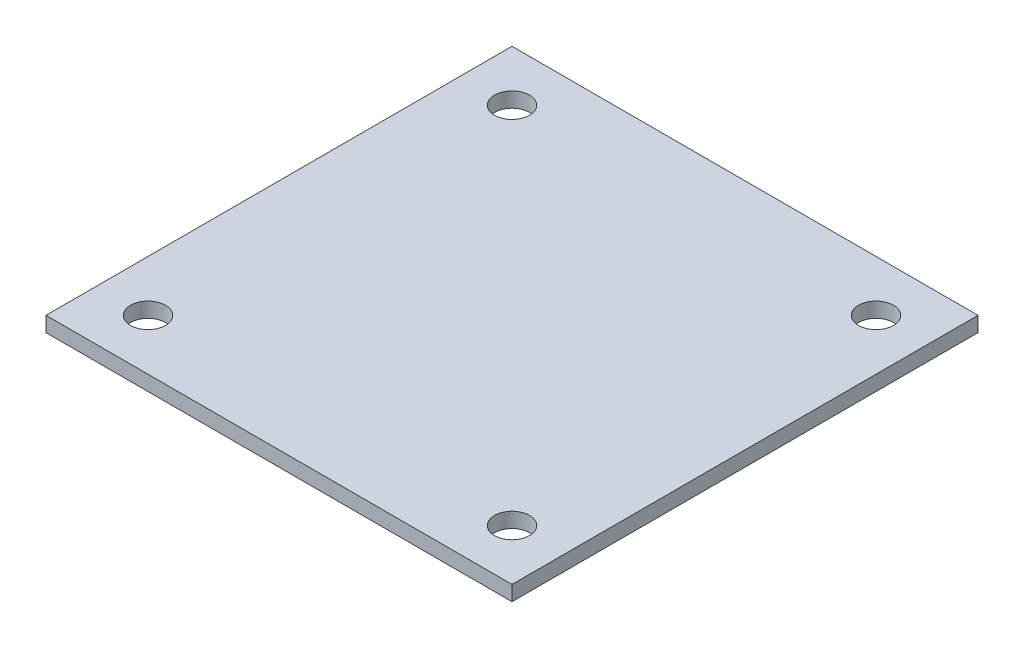
ISO-10303-21;
HEADER;
FILE_DESCRIPTION(('STEP AP214'),'2;1');
FILE_NAME('part.step','',(''),(''),'','','');
FILE_SCHEMA(('AUTOMOTIVE_DESIGN { 1 0 10303 214 1 1 1 1 }'));
ENDSEC;
DATA;
#1=APPLICATION_CONTEXT('core data for automotive mechanical design processes');
#2=APPLICATION_PROTOCOL_DEFINITION('international standard','automotive_design',2000,#1);
#3=PRODUCT_CONTEXT('',#1,'mechanical');
#4=PRODUCT('Part','Part','',(#3));
#5=PRODUCT_RELATED_PRODUCT_CATEGORY('part','',(#4));
#6=PRODUCT_DEFINITION_FORMATION('','',#4);
#7=PRODUCT_DEFINITION_CONTEXT('part definition',#1,'design');
#8=PRODUCT_DEFINITION('design','',#6,#7);
#9=PRODUCT_DEFINITION_SHAPE('','',#8);
#10=(LENGTH_UNIT() NAMED_UNIT(*) SI_UNIT(.MILLI.,.METRE.));
#11=(NAMED_UNIT(*) PLANE_ANGLE_UNIT() SI_UNIT($,.RADIAN.));
#12=(NAMED_UNIT(*) SI_UNIT($,.STERADIAN.) SOLID_ANGLE_UNIT());
#13=UNCERTAINTY_MEASURE_WITH_UNIT(LENGTH_MEASURE(1.E-05),#10,'distance_accuracy_value','');
#14=(GEOMETRIC_REPRESENTATION_CONTEXT(3) GLOBAL_UNCERTAINTY_ASSIGNED_CONTEXT((#13)) GLOBAL_UNIT_ASSIGNED_CONTEXT((#10,
#11,#12)) REPRESENTATION_CONTEXT('',''));
#15=CARTESIAN_POINT('',(0.,0.,0.));
#16=DIRECTION('',(0.,0.,1.));
#17=DIRECTION('',(1.,0.,0.));
#18=AXIS2_PLACEMENT_3D('',#15,#16,#17);
#19=CARTESIAN_POINT('',(0.,1.5,0.));
#20=DIRECTION('',(0.,1.,0.));
#21=DIRECTION('',(0.,0.,1.));
#22=AXIS2_PLACEMENT_3D('',#19,#20,#21);
#23=PLANE('',#22);
#24=CARTESIAN_POINT('',(18.2,1.5,18.2));
#25=DIRECTION('',(0.,1.,0.));
#26=DIRECTION('',(0.,0.,-1.));
#27=AXIS2_PLACEMENT_3D('',#24,#25,#26);
#28=CIRCLE('',#27,1.75);
#29=CARTESIAN_POINT('',(18.2,1.5,16.45));
#30=VERTEX_POINT('',#29);
#31=EDGE_CURVE('E125',#30,#30,#28,.T.);
#32=ORIENTED_EDGE('',*,*,#31,.F.);
#33=EDGE_LOOP('',(#32));
#34=FACE_BOUND('',#33,.T.);
#35=CARTESIAN_POINT('',(-18.2,1.5,-18.2));
#36=DIRECTION('',(0.,1.,0.));
#37=DIRECTION('',(0.,0.,1.));
#38=AXIS2_PLACEMENT_3D('',#35,#36,#37);
#39=CIRCLE('',#38,1.75);
#40=CARTESIAN_POINT('',(-18.2,1.5,-16.45));
#41=VERTEX_POINT('',#40);
#42=EDGE_CURVE('E104',#41,#41,#39,.T.);
#43=ORIENTED_EDGE('',*,*,#42,.F.);
#44=EDGE_LOOP('',(#43));
#45=FACE_BOUND('',#44,.T.);
#46=DIRECTION('',(0.,0.,-1.));
#47=VECTOR('',#46,1.);
#48=CARTESIAN_POINT('',(23.3,1.5,-23.3));
#49=LINE('',#48,#47);
#50=CARTESIAN_POINT('',(23.3,1.5,23.3));
#51=VERTEX_POINT('',#50);
#52=CARTESIAN_POINT('',(23.3,1.5,-23.3));
#53=VERTEX_POINT('',#52);
#54=EDGE_CURVE('E89',#51,#53,#49,.T.);
#55=ORIENTED_EDGE('',*,*,#54,.T.);
#56=DIRECTION('',(-1.,0.,0.));
#57=VECTOR('',#56,1.);
#58=CARTESIAN_POINT('',(-23.3,1.5,-23.3));
#59=LINE('',#58,#57);
#60=CARTESIAN_POINT('',(-23.3,1.5,-23.3));
#61=VERTEX_POINT('',#60);
#62=EDGE_CURVE('E84',#53,#61,#59,.T.);
#63=ORIENTED_EDGE('',*,*,#62,.T.);
#64=DIRECTION('',(0.,0.,1.));
#65=VECTOR('',#64,1.);
#66=CARTESIAN_POINT('',(-23.3,1.5,-23.3));
#67=LINE('',#66,#65);
#68=CARTESIAN_POINT('',(-23.3,1.5,23.3));
#69=VERTEX_POINT('',#68);
#70=EDGE_CURVE('E87',#61,#69,#67,.T.);
#71=ORIENTED_EDGE('',*,*,#70,.T.);
#72=DIRECTION('',(1.,0.,0.));
#73=VECTOR('',#72,1.);
#74=CARTESIAN_POINT('',(-23.3,1.5,23.3));
#75=LINE('',#74,#73);
#76=EDGE_CURVE('E54',#69,#51,#75,.T.);
#77=ORIENTED_EDGE('',*,*,#76,.T.);
#78=EDGE_LOOP('',(#55,#63,#71,#77));
#79=FACE_BOUND('',#78,.T.);
#80=CARTESIAN_POINT('',(-18.2,1.5,18.2));
#81=DIRECTION('',(0.,1.,0.));
#82=DIRECTION('',(0.,0.,1.));
#83=AXIS2_PLACEMENT_3D('',#80,#81,#82);
#84=CIRCLE('',#83,1.75);
#85=CARTESIAN_POINT('',(-18.2,1.5,19.95));
#86=VERTEX_POINT('',#85);
#87=EDGE_CURVE('E119',#86,#86,#84,.T.);
#88=ORIENTED_EDGE('',*,*,#87,.F.);
#89=EDGE_LOOP('',(#88));
#90=FACE_BOUND('',#89,.T.);
#91=CARTESIAN_POINT('',(18.2,1.5,-18.2));
#92=DIRECTION('',(0.,1.,0.));
#93=DIRECTION('',(0.,0.,-1.));
#94=AXIS2_PLACEMENT_3D('',#91,#92,#93);
#95=CIRCLE('',#94,1.75);
#96=CARTESIAN_POINT('',(18.2,1.5,-19.95));
#97=VERTEX_POINT('',#96);
#98=EDGE_CURVE('E131',#97,#97,#95,.T.);
#99=ORIENTED_EDGE('',*,*,#98,.F.);
#100=EDGE_LOOP('',(#99));
#101=FACE_BOUND('',#100,.T.);
#102=ADVANCED_FACE('F37',(#34,#45,#79,#90,#101),#23,.T.);
#103=CARTESIAN_POINT('',(0.,0.,0.));
#104=DIRECTION('',(0.,1.,0.));
#105=DIRECTION('',(0.,0.,1.));
#106=AXIS2_PLACEMENT_3D('',#103,#104,#105);
#107=PLANE('',#106);
#108=DIRECTION('',(0.,0.,-1.));
#109=VECTOR('',#108,1.);
#110=CARTESIAN_POINT('',(23.3,0.,-23.3));
#111=LINE('',#110,#109);
#112=CARTESIAN_POINT('',(23.3,0.,23.3));
#113=VERTEX_POINT('',#112);
#114=CARTESIAN_POINT('',(23.3,0.,-23.3));
#115=VERTEX_POINT('',#114);
#116=EDGE_CURVE('E101',#113,#115,#111,.T.);
#117=ORIENTED_EDGE('',*,*,#116,.F.);
#118=DIRECTION('',(1.,0.,0.));
#119=VECTOR('',#118,1.);
#120=CARTESIAN_POINT('',(-23.3,0.,23.3));
#121=LINE('',#120,#119);
#122=CARTESIAN_POINT('',(-23.3,0.,23.3));
#123=VERTEX_POINT('',#122);
#124=EDGE_CURVE('E77',#123,#113,#121,.T.);
#125=ORIENTED_EDGE('',*,*,#124,.F.);
#126=DIRECTION('',(0.,0.,1.));
#127=VECTOR('',#126,1.);
#128=CARTESIAN_POINT('',(-23.3,0.,-23.3));
#129=LINE('',#128,#127);
#130=CARTESIAN_POINT('',(-23.3,0.,-23.3));
#131=VERTEX_POINT('',#130);
#132=EDGE_CURVE('E71',#131,#123,#129,.T.);
#133=ORIENTED_EDGE('',*,*,#132,.F.);
#134=DIRECTION('',(-1.,0.,0.));
#135=VECTOR('',#134,1.);
#136=CARTESIAN_POINT('',(-23.3,0.,-23.3));
#137=LINE('',#136,#135);
#138=EDGE_CURVE('E93',#115,#131,#137,.T.);
#139=ORIENTED_EDGE('',*,*,#138,.F.);
#140=EDGE_LOOP('',(#117,#125,#133,#139));
#141=FACE_BOUND('',#140,.T.);
#142=CARTESIAN_POINT('',(-18.2,0.,-18.2));
#143=DIRECTION('',(0.,1.,0.));
#144=DIRECTION('',(0.,0.,1.));
#145=AXIS2_PLACEMENT_3D('',#142,#143,#144);
#146=CIRCLE('',#145,1.75);
#147=CARTESIAN_POINT('',(-18.2,0.,-16.45));
#148=VERTEX_POINT('',#147);
#149=EDGE_CURVE('E116',#148,#148,#146,.T.);
#150=ORIENTED_EDGE('',*,*,#149,.T.);
#151=EDGE_LOOP('',(#150));
#152=FACE_BOUND('',#151,.T.);
#153=CARTESIAN_POINT('',(-18.2,0.,18.2));
#154=DIRECTION('',(0.,1.,0.));
#155=DIRECTION('',(0.,0.,1.));
#156=AXIS2_PLACEMENT_3D('',#153,#154,#155);
#157=CIRCLE('',#156,1.75);
#158=CARTESIAN_POINT('',(-18.2,0.,19.95));
#159=VERTEX_POINT('',#158);
#160=EDGE_CURVE('E122',#159,#159,#157,.T.);
#161=ORIENTED_EDGE('',*,*,#160,.T.);
#162=EDGE_LOOP('',(#161));
#163=FACE_BOUND('',#162,.T.);
#164=CARTESIAN_POINT('',(18.2,0.,18.2));
#165=DIRECTION('',(0.,1.,0.));
#166=DIRECTION('',(0.,0.,-1.));
#167=AXIS2_PLACEMENT_3D('',#164,#165,#166);
#168=CIRCLE('',#167,1.75);
#169=CARTESIAN_POINT('',(18.2,0.,16.45));
#170=VERTEX_POINT('',#169);
#171=EDGE_CURVE('E128',#170,#170,#168,.T.);
#172=ORIENTED_EDGE('',*,*,#171,.T.);
#173=EDGE_LOOP('',(#172));
#174=FACE_BOUND('',#173,.T.);
#175=CARTESIAN_POINT('',(18.2,0.,-18.2));
#176=DIRECTION('',(0.,1.,0.));
#177=DIRECTION('',(0.,0.,-1.));
#178=AXIS2_PLACEMENT_3D('',#175,#176,#177);
#179=CIRCLE('',#178,1.75);
#180=CARTESIAN_POINT('',(18.2,0.,-19.95));
#181=VERTEX_POINT('',#180);
#182=EDGE_CURVE('E134',#181,#181,#179,.T.);
#183=ORIENTED_EDGE('',*,*,#182,.T.);
#184=EDGE_LOOP('',(#183));
#185=FACE_BOUND('',#184,.T.);
#186=ADVANCED_FACE('F112',(#141,#152,#163,#174,#185),#107,.F.);
#187=CARTESIAN_POINT('',(23.3,1.5,-23.3));
#188=DIRECTION('',(-1.,0.,0.));
#189=DIRECTION('',(0.,0.,1.));
#190=AXIS2_PLACEMENT_3D('',#187,#188,#189);
#191=PLANE('',#190);
#192=ORIENTED_EDGE('',*,*,#116,.T.);
#193=DIRECTION('',(0.,-1.,0.));
#194=VECTOR('',#193,1.);
#195=CARTESIAN_POINT('',(23.3,1.5,-23.3));
#196=LINE('',#195,#194);
#197=EDGE_CURVE('E11',#53,#115,#196,.T.);
#198=ORIENTED_EDGE('',*,*,#197,.F.);
#199=ORIENTED_EDGE('',*,*,#54,.F.);
#200=DIRECTION('',(0.,-1.,0.));
#201=VECTOR('',#200,1.);
#202=CARTESIAN_POINT('',(23.3,1.5,23.3));
#203=LINE('',#202,#201);
#204=EDGE_CURVE('E97',#51,#113,#203,.T.);
#205=ORIENTED_EDGE('',*,*,#204,.T.);
#206=EDGE_LOOP('',(#192,#198,#199,#205));
#207=FACE_BOUND('',#206,.T.);
#208=ADVANCED_FACE('F39',(#207),#191,.F.);
#209=CARTESIAN_POINT('',(-23.3,1.5,-23.3));
#210=DIRECTION('',(0.,0.,1.));
#211=DIRECTION('',(1.,0.,0.));
#212=AXIS2_PLACEMENT_3D('',#209,#210,#211);
#213=PLANE('',#212);
#214=ORIENTED_EDGE('',*,*,#138,.T.);
#215=DIRECTION('',(0.,-1.,0.));
#216=VECTOR('',#215,1.);
#217=CARTESIAN_POINT('',(-23.3,1.5,-23.3));
#218=LINE('',#217,#216);
#219=EDGE_CURVE('E46',#61,#131,#218,.T.);
#220=ORIENTED_EDGE('',*,*,#219,.F.);
#221=ORIENTED_EDGE('',*,*,#62,.F.);
#222=ORIENTED_EDGE('',*,*,#197,.T.);
#223=EDGE_LOOP('',(#214,#220,#221,#222));
#224=FACE_BOUND('',#223,.T.);
#225=ADVANCED_FACE('F92',(#224),#213,.F.);
#226=CARTESIAN_POINT('',(-23.3,1.5,-23.3));
#227=DIRECTION('',(1.,0.,0.));
#228=DIRECTION('',(0.,0.,-1.));
#229=AXIS2_PLACEMENT_3D('',#226,#227,#228);
#230=PLANE('',#229);
#231=ORIENTED_EDGE('',*,*,#132,.T.);
#232=DIRECTION('',(0.,-1.,0.));
#233=VECTOR('',#232,1.);
#234=CARTESIAN_POINT('',(-23.3,1.5,23.3));
#235=LINE('',#234,#233);
#236=EDGE_CURVE('E94',#69,#123,#235,.T.);
#237=ORIENTED_EDGE('',*,*,#236,.F.);
#238=ORIENTED_EDGE('',*,*,#70,.F.);
#239=ORIENTED_EDGE('',*,*,#219,.T.);
#240=EDGE_LOOP('',(#231,#237,#238,#239));
#241=FACE_BOUND('',#240,.T.);
#242=ADVANCED_FACE('F95',(#241),#230,.F.);
#243=CARTESIAN_POINT('',(-23.3,1.5,23.3));
#244=DIRECTION('',(0.,0.,-1.));
#245=DIRECTION('',(-1.,0.,0.));
#246=AXIS2_PLACEMENT_3D('',#243,#244,#245);
#247=PLANE('',#246);
#248=ORIENTED_EDGE('',*,*,#124,.T.);
#249=ORIENTED_EDGE('',*,*,#204,.F.);
#250=ORIENTED_EDGE('',*,*,#76,.F.);
#251=ORIENTED_EDGE('',*,*,#236,.T.);
#252=EDGE_LOOP('',(#248,#249,#250,#251));
#253=FACE_BOUND('',#252,.T.);
#254=ADVANCED_FACE('F109',(#253),#247,.F.);
#255=CARTESIAN_POINT('',(-18.2,1.5,-18.2));
#256=DIRECTION('',(0.,-1.,0.));
#257=DIRECTION('',(0.,0.,-1.));
#258=AXIS2_PLACEMENT_3D('',#255,#256,#257);
#259=CYLINDRICAL_SURFACE('',#258,1.75);
#260=ORIENTED_EDGE('',*,*,#42,.T.);
#261=EDGE_LOOP('',(#260));
#262=FACE_BOUND('',#261,.T.);
#263=ORIENTED_EDGE('',*,*,#149,.F.);
#264=EDGE_LOOP('',(#263));
#265=FACE_BOUND('',#264,.T.);
#266=ADVANCED_FACE('F153',(#262,#265),#259,.F.);
#267=CARTESIAN_POINT('',(-18.2,1.5,18.2));
#268=DIRECTION('',(0.,-1.,0.));
#269=DIRECTION('',(0.,0.,-1.));
#270=AXIS2_PLACEMENT_3D('',#267,#268,#269);
#271=CYLINDRICAL_SURFACE('',#270,1.75);
#272=ORIENTED_EDGE('',*,*,#87,.T.);
#273=EDGE_LOOP('',(#272));
#274=FACE_BOUND('',#273,.T.);
#275=ORIENTED_EDGE('',*,*,#160,.F.);
#276=EDGE_LOOP('',(#275));
#277=FACE_BOUND('',#276,.T.);
#278=ADVANCED_FACE('F207',(#274,#277),#271,.F.);
#279=CARTESIAN_POINT('',(18.2,1.5,18.2));
#280=DIRECTION('',(0.,-1.,0.));
#281=DIRECTION('',(0.,0.,-1.));
#282=AXIS2_PLACEMENT_3D('',#279,#280,#281);
#283=CYLINDRICAL_SURFACE('',#282,1.75);
#284=ORIENTED_EDGE('',*,*,#31,.T.);
#285=EDGE_LOOP('',(#284));
#286=FACE_BOUND('',#285,.T.);
#287=ORIENTED_EDGE('',*,*,#171,.F.);
#288=EDGE_LOOP('',(#287));
#289=FACE_BOUND('',#288,.T.);
#290=ADVANCED_FACE('F216',(#286,#289),#283,.F.);
#291=CARTESIAN_POINT('',(18.2,1.5,-18.2));
#292=DIRECTION('',(0.,-1.,0.));
#293=DIRECTION('',(0.,0.,-1.));
#294=AXIS2_PLACEMENT_3D('',#291,#292,#293);
#295=CYLINDRICAL_SURFACE('',#294,1.75);
#296=ORIENTED_EDGE('',*,*,#98,.T.);
#297=EDGE_LOOP('',(#296));
#298=FACE_BOUND('',#297,.T.);
#299=ORIENTED_EDGE('',*,*,#182,.F.);
#300=EDGE_LOOP('',(#299));
#301=FACE_BOUND('',#300,.T.);
#302=ADVANCED_FACE('F140',(#298,#301),#295,.F.);
#303=CLOSED_SHELL('',(#102,#186,#208,#225,#242,#254,#266,#278,#290,#302));
#304=MANIFOLD_SOLID_BREP('B2',#303);
#305=ADVANCED_BREP_SHAPE_REPRESENTATION('',(#18,#304),#14);
#306=SHAPE_DEFINITION_REPRESENTATION(#9,#305);
ENDSEC;
END-ISO-10303-21;
